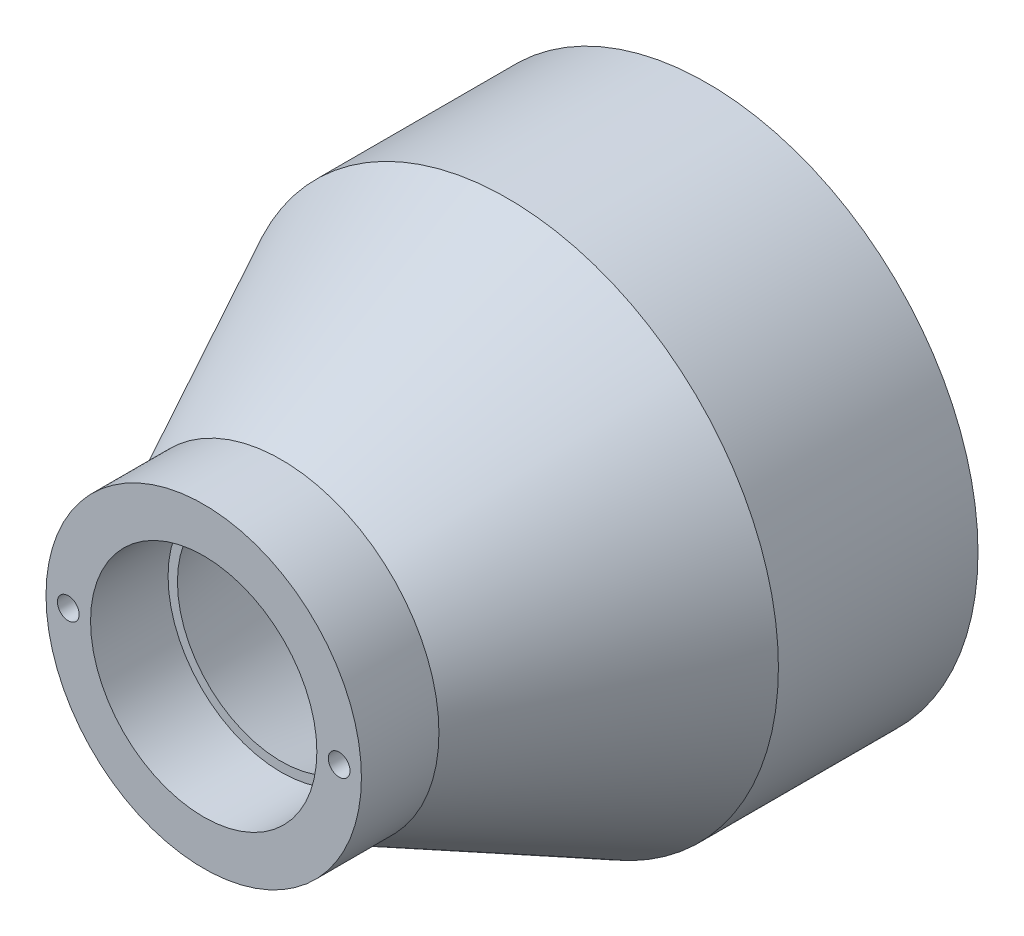
ISO-10303-21;
HEADER;
FILE_DESCRIPTION(('STEP AP214'),'2;1');
FILE_NAME('part.step','',(''),(''),'','','');
FILE_SCHEMA(('AUTOMOTIVE_DESIGN { 1 0 10303 214 1 1 1 1 }'));
ENDSEC;
DATA;
#1=APPLICATION_CONTEXT('core data for automotive mechanical design processes');
#2=APPLICATION_PROTOCOL_DEFINITION('international standard','automotive_design',2000,#1);
#3=PRODUCT_CONTEXT('',#1,'mechanical');
#4=PRODUCT('Part','Part','',(#3));
#5=PRODUCT_RELATED_PRODUCT_CATEGORY('part','',(#4));
#6=PRODUCT_DEFINITION_FORMATION('','',#4);
#7=PRODUCT_DEFINITION_CONTEXT('part definition',#1,'design');
#8=PRODUCT_DEFINITION('design','',#6,#7);
#9=PRODUCT_DEFINITION_SHAPE('','',#8);
#10=(LENGTH_UNIT() NAMED_UNIT(*) SI_UNIT(.MILLI.,.METRE.));
#11=(NAMED_UNIT(*) PLANE_ANGLE_UNIT() SI_UNIT($,.RADIAN.));
#12=(NAMED_UNIT(*) SI_UNIT($,.STERADIAN.) SOLID_ANGLE_UNIT());
#13=UNCERTAINTY_MEASURE_WITH_UNIT(LENGTH_MEASURE(1.E-05),#10,'distance_accuracy_value','');
#14=(GEOMETRIC_REPRESENTATION_CONTEXT(3) GLOBAL_UNCERTAINTY_ASSIGNED_CONTEXT((#13)) GLOBAL_UNIT_ASSIGNED_CONTEXT((#10,
#11,#12)) REPRESENTATION_CONTEXT('',''));
#15=CARTESIAN_POINT('',(0.,0.,0.));
#16=DIRECTION('',(0.,0.,1.));
#17=DIRECTION('',(1.,0.,0.));
#18=AXIS2_PLACEMENT_3D('',#15,#16,#17);
#19=CARTESIAN_POINT('',(0.,0.,8.7));
#20=DIRECTION('',(0.,0.,1.));
#21=DIRECTION('',(1.,0.,0.));
#22=AXIS2_PLACEMENT_3D('',#19,#20,#21);
#23=PLANE('',#22);
#24=CARTESIAN_POINT('',(-15.2,0.,8.7));
#25=DIRECTION('',(0.,0.,1.));
#26=DIRECTION('',(1.,0.,0.));
#27=AXIS2_PLACEMENT_3D('',#24,#25,#26);
#28=CIRCLE('',#27,1.2192);
#29=CARTESIAN_POINT('',(-13.9808,0.,8.7));
#30=VERTEX_POINT('',#29);
#31=EDGE_CURVE('E63',#30,#30,#28,.T.);
#32=ORIENTED_EDGE('',*,*,#31,.F.);
#33=EDGE_LOOP('',(#32));
#34=FACE_BOUND('',#33,.T.);
#35=CARTESIAN_POINT('',(15.2,0.,8.7));
#36=DIRECTION('',(0.,0.,1.));
#37=DIRECTION('',(1.,0.,0.));
#38=AXIS2_PLACEMENT_3D('',#35,#36,#37);
#39=CIRCLE('',#38,1.2192);
#40=CARTESIAN_POINT('',(16.4192,0.,8.7));
#41=VERTEX_POINT('',#40);
#42=EDGE_CURVE('E62',#41,#41,#39,.T.);
#43=ORIENTED_EDGE('',*,*,#42,.F.);
#44=EDGE_LOOP('',(#43));
#45=FACE_BOUND('',#44,.T.);
#46=CARTESIAN_POINT('',(0.,0.,8.7));
#47=DIRECTION('',(0.,0.,1.));
#48=DIRECTION('',(1.,0.,0.));
#49=AXIS2_PLACEMENT_3D('',#46,#47,#48);
#50=CIRCLE('',#49,17.7);
#51=CARTESIAN_POINT('',(17.7,0.,8.7));
#52=VERTEX_POINT('',#51);
#53=EDGE_CURVE('E80',#52,#52,#50,.T.);
#54=ORIENTED_EDGE('',*,*,#53,.T.);
#55=EDGE_LOOP('',(#54));
#56=FACE_BOUND('',#55,.T.);
#57=CARTESIAN_POINT('',(0.,0.,8.7));
#58=DIRECTION('',(0.,0.,1.));
#59=DIRECTION('',(1.,0.,0.));
#60=AXIS2_PLACEMENT_3D('',#57,#58,#59);
#61=CIRCLE('',#60,12.7);
#62=CARTESIAN_POINT('',(12.7,0.,8.7));
#63=VERTEX_POINT('',#62);
#64=EDGE_CURVE('E77',#63,#63,#61,.T.);
#65=ORIENTED_EDGE('',*,*,#64,.F.);
#66=EDGE_LOOP('',(#65));
#67=FACE_BOUND('',#66,.T.);
#68=ADVANCED_FACE('F37',(#34,#45,#56,#67),#23,.T.);
#69=CARTESIAN_POINT('',(0.,0.,8.7));
#70=DIRECTION('',(0.,0.,-1.));
#71=DIRECTION('',(-1.,0.,0.));
#72=AXIS2_PLACEMENT_3D('',#69,#70,#71);
#73=CYLINDRICAL_SURFACE('',#72,17.7);
#74=ORIENTED_EDGE('',*,*,#53,.F.);
#75=EDGE_LOOP('',(#74));
#76=FACE_BOUND('',#75,.T.);
#77=CARTESIAN_POINT('',(0.,0.,0.));
#78=DIRECTION('',(0.,0.,1.));
#79=DIRECTION('',(1.,0.,0.));
#80=AXIS2_PLACEMENT_3D('',#77,#78,#79);
#81=CIRCLE('',#80,17.7);
#82=CARTESIAN_POINT('',(17.7,0.,0.));
#83=VERTEX_POINT('',#82);
#84=EDGE_CURVE('E76',#83,#83,#81,.T.);
#85=ORIENTED_EDGE('',*,*,#84,.T.);
#86=EDGE_LOOP('',(#85));
#87=FACE_BOUND('',#86,.T.);
#88=ADVANCED_FACE('F112',(#76,#87),#73,.T.);
#89=CARTESIAN_POINT('',(0.,0.,8.7));
#90=DIRECTION('',(0.,0.,-1.));
#91=DIRECTION('',(-1.,0.,0.));
#92=AXIS2_PLACEMENT_3D('',#89,#90,#91);
#93=CYLINDRICAL_SURFACE('',#92,12.7);
#94=ORIENTED_EDGE('',*,*,#64,.T.);
#95=EDGE_LOOP('',(#94));
#96=FACE_BOUND('',#95,.T.);
#97=CARTESIAN_POINT('',(0.,0.,0.));
#98=DIRECTION('',(0.,0.,1.));
#99=DIRECTION('',(1.,0.,0.));
#100=AXIS2_PLACEMENT_3D('',#97,#98,#99);
#101=CIRCLE('',#100,12.7);
#102=CARTESIAN_POINT('',(12.7,0.,0.));
#103=VERTEX_POINT('',#102);
#104=EDGE_CURVE('E81',#103,#103,#101,.T.);
#105=ORIENTED_EDGE('',*,*,#104,.F.);
#106=EDGE_LOOP('',(#105));
#107=FACE_BOUND('',#106,.T.);
#108=ADVANCED_FACE('F118',(#96,#107),#93,.F.);
#109=CARTESIAN_POINT('',(0.,0.,0.));
#110=DIRECTION('',(0.,0.,-1.));
#111=DIRECTION('',(-1.,0.,0.));
#112=AXIS2_PLACEMENT_3D('',#109,#110,#111);
#113=PLANE('',#112);
#114=CARTESIAN_POINT('',(0.,0.,0.));
#115=DIRECTION('',(0.,0.,-1.));
#116=DIRECTION('',(-1.,0.,0.));
#117=AXIS2_PLACEMENT_3D('',#114,#115,#116);
#118=CIRCLE('',#117,11.6498025714429);
#119=CARTESIAN_POINT('',(-11.6498025714429,0.,0.));
#120=VERTEX_POINT('',#119);
#121=EDGE_CURVE('E46',#120,#120,#118,.T.);
#122=ORIENTED_EDGE('',*,*,#121,.T.);
#123=EDGE_LOOP('',(#122));
#124=FACE_BOUND('',#123,.T.);
#125=ORIENTED_EDGE('',*,*,#104,.T.);
#126=EDGE_LOOP('',(#125));
#127=FACE_BOUND('',#126,.T.);
#128=ADVANCED_FACE('F96',(#124,#127),#113,.F.);
#129=CARTESIAN_POINT('',(0.,0.,-47.8));
#130=DIRECTION('',(0.,0.,-1.));
#131=DIRECTION('',(-1.,0.,0.));
#132=AXIS2_PLACEMENT_3D('',#129,#130,#131);
#133=PLANE('',#132);
#134=CARTESIAN_POINT('',(0.,0.,-47.8));
#135=DIRECTION('',(0.,0.,-1.));
#136=DIRECTION('',(-1.,0.,0.));
#137=AXIS2_PLACEMENT_3D('',#134,#135,#136);
#138=CIRCLE('',#137,22.4000840289286);
#139=CARTESIAN_POINT('',(-22.4000840289286,0.,-47.8));
#140=VERTEX_POINT('',#139);
#141=EDGE_CURVE('E11',#140,#140,#138,.F.);
#142=ORIENTED_EDGE('',*,*,#141,.T.);
#143=EDGE_LOOP('',(#142));
#144=FACE_BOUND('',#143,.T.);
#145=CARTESIAN_POINT('',(0.,0.,-47.8));
#146=DIRECTION('',(0.,0.,-1.));
#147=DIRECTION('',(-1.,0.,0.));
#148=AXIS2_PLACEMENT_3D('',#145,#146,#147);
#149=CIRCLE('',#148,30.4);
#150=CARTESIAN_POINT('',(30.4,0.,-47.8));
#151=VERTEX_POINT('',#150);
#152=EDGE_CURVE('E73',#151,#151,#149,.T.);
#153=ORIENTED_EDGE('',*,*,#152,.T.);
#154=EDGE_LOOP('',(#153));
#155=FACE_BOUND('',#154,.T.);
#156=ADVANCED_FACE('F138',(#144,#155),#133,.T.);
#157=CARTESIAN_POINT('',(0.,0.,0.));
#158=DIRECTION('',(0.,0.,-1.));
#159=DIRECTION('',(-1.,0.,0.));
#160=AXIS2_PLACEMENT_3D('',#157,#158,#159);
#161=CIRCLE('',#160,17.7000283593577);
#162=CARTESIAN_POINT('',(-17.7000283593577,0.,0.));
#163=VERTEX_POINT('',#162);
#164=EDGE_CURVE('E91',#163,#163,#161,.F.);
#165=ORIENTED_EDGE('',*,*,#164,.T.);
#166=EDGE_LOOP('',(#165));
#167=FACE_BOUND('',#166,.T.);
#168=ORIENTED_EDGE('',*,*,#84,.F.);
#169=EDGE_LOOP('',(#168));
#170=FACE_BOUND('',#169,.T.);
#171=ADVANCED_FACE('F134',(#167,#170),#113,.F.);
#172=CARTESIAN_POINT('',(0.,0.,-47.8));
#173=DIRECTION('',(0.,0.,1.));
#174=DIRECTION('',(1.,0.,0.));
#175=AXIS2_PLACEMENT_3D('',#172,#173,#174);
#176=CYLINDRICAL_SURFACE('',#175,30.4);
#177=CARTESIAN_POINT('',(0.,0.,-25.4));
#178=DIRECTION('',(0.,0.,-1.));
#179=DIRECTION('',(-1.,0.,0.));
#180=AXIS2_PLACEMENT_3D('',#177,#178,#179);
#181=CIRCLE('',#180,30.4);
#182=CARTESIAN_POINT('',(30.4,0.,-25.4));
#183=VERTEX_POINT('',#182);
#184=EDGE_CURVE('E86',#183,#183,#181,.T.);
#185=CARTESIAN_POINT('',(30.4,0.,-25.4));
#186=CARTESIAN_POINT('',(30.4,0.,-25.6333333333333));
#187=CARTESIAN_POINT('',(30.4,0.,-25.8666666666667));
#188=CARTESIAN_POINT('',(30.4,0.,-26.3333333333333));
#189=CARTESIAN_POINT('',(30.4,0.,-26.5666666666667));
#190=CARTESIAN_POINT('',(30.4,0.,-27.0333333333333));
#191=CARTESIAN_POINT('',(30.4,0.,-27.2666666666667));
#192=CARTESIAN_POINT('',(30.4,0.,-27.7333333333333));
#193=CARTESIAN_POINT('',(30.4,0.,-27.9666666666667));
#194=CARTESIAN_POINT('',(30.4,0.,-28.4333333333333));
#195=CARTESIAN_POINT('',(30.4,0.,-28.6666666666667));
#196=CARTESIAN_POINT('',(30.4,0.,-29.1333333333333));
#197=CARTESIAN_POINT('',(30.4,0.,-29.3666666666667));
#198=CARTESIAN_POINT('',(30.4,0.,-29.8333333333333));
#199=CARTESIAN_POINT('',(30.4,0.,-30.0666666666667));
#200=CARTESIAN_POINT('',(30.4,0.,-30.5333333333333));
#201=CARTESIAN_POINT('',(30.4,0.,-30.7666666666667));
#202=CARTESIAN_POINT('',(30.4,0.,-31.2333333333333));
#203=CARTESIAN_POINT('',(30.4,0.,-31.4666666666667));
#204=CARTESIAN_POINT('',(30.4,0.,-31.9333333333333));
#205=CARTESIAN_POINT('',(30.4,0.,-32.1666666666667));
#206=CARTESIAN_POINT('',(30.4,0.,-32.6333333333333));
#207=CARTESIAN_POINT('',(30.4,0.,-32.8666666666667));
#208=CARTESIAN_POINT('',(30.4,0.,-33.3333333333333));
#209=CARTESIAN_POINT('',(30.4,0.,-33.5666666666667));
#210=CARTESIAN_POINT('',(30.4,0.,-34.0333333333333));
#211=CARTESIAN_POINT('',(30.4,0.,-34.2666666666667));
#212=CARTESIAN_POINT('',(30.4,0.,-34.7333333333333));
#213=CARTESIAN_POINT('',(30.4,0.,-34.9666666666667));
#214=CARTESIAN_POINT('',(30.4,0.,-35.4333333333333));
#215=CARTESIAN_POINT('',(30.4,0.,-35.6666666666667));
#216=CARTESIAN_POINT('',(30.4,0.,-36.1333333333333));
#217=CARTESIAN_POINT('',(30.4,0.,-36.3666666666667));
#218=CARTESIAN_POINT('',(30.4,0.,-36.8333333333333));
#219=CARTESIAN_POINT('',(30.4,0.,-37.0666666666667));
#220=CARTESIAN_POINT('',(30.4,0.,-37.5333333333333));
#221=CARTESIAN_POINT('',(30.4,0.,-37.7666666666667));
#222=CARTESIAN_POINT('',(30.4,0.,-38.2333333333333));
#223=CARTESIAN_POINT('',(30.4,0.,-38.4666666666667));
#224=CARTESIAN_POINT('',(30.4,0.,-38.9333333333333));
#225=CARTESIAN_POINT('',(30.4,0.,-39.1666666666667));
#226=CARTESIAN_POINT('',(30.4,0.,-39.6333333333333));
#227=CARTESIAN_POINT('',(30.4,0.,-39.8666666666667));
#228=CARTESIAN_POINT('',(30.4,0.,-40.3333333333333));
#229=CARTESIAN_POINT('',(30.4,0.,-40.5666666666667));
#230=CARTESIAN_POINT('',(30.4,0.,-41.0333333333333));
#231=CARTESIAN_POINT('',(30.4,0.,-41.2666666666667));
#232=CARTESIAN_POINT('',(30.4,0.,-41.7333333333333));
#233=CARTESIAN_POINT('',(30.4,0.,-41.9666666666667));
#234=CARTESIAN_POINT('',(30.4,0.,-42.4333333333333));
#235=CARTESIAN_POINT('',(30.4,0.,-42.6666666666667));
#236=CARTESIAN_POINT('',(30.4,0.,-43.1333333333333));
#237=CARTESIAN_POINT('',(30.4,0.,-43.3666666666667));
#238=CARTESIAN_POINT('',(30.4,0.,-43.8333333333333));
#239=CARTESIAN_POINT('',(30.4,0.,-44.0666666666667));
#240=CARTESIAN_POINT('',(30.4,0.,-44.5333333333333));
#241=CARTESIAN_POINT('',(30.4,0.,-44.7666666666667));
#242=CARTESIAN_POINT('',(30.4,0.,-45.2333333333333));
#243=CARTESIAN_POINT('',(30.4,0.,-45.4666666666667));
#244=CARTESIAN_POINT('',(30.4,0.,-45.9333333333333));
#245=CARTESIAN_POINT('',(30.4,0.,-46.1666666666667));
#246=CARTESIAN_POINT('',(30.4,0.,-46.6333333333333));
#247=CARTESIAN_POINT('',(30.4,0.,-46.8666666666667));
#248=CARTESIAN_POINT('',(30.4,0.,-47.3333333333333));
#249=CARTESIAN_POINT('',(30.4,0.,-47.5666666666667));
#250=CARTESIAN_POINT('',(30.4,0.,-47.8));
#251=B_SPLINE_CURVE_WITH_KNOTS('',3,(#185,#186,#187,#188,#189,#190,#191,#192,#193,#194,#195,
#196,#197,#198,#199,#200,#201,#202,#203,#204,#205,#206,#207,#208,#209,#210,#211,#212,#213,#214,
#215,#216,#217,#218,#219,#220,#221,#222,#223,#224,#225,#226,#227,#228,#229,#230,#231,#232,#233,
#234,#235,#236,#237,#238,#239,#240,#241,#242,#243,#244,#245,#246,#247,#248,#249,#250),
.UNSPECIFIED.,.F.,.F.,(4,2,2,2,2,2,2,2,2,2,2,2,2,2,2,2,2,2,2,2,2,2,2,2,2,2,2,2,2,2,2,2,4),(0.,
0.699999999999999,1.4,2.1,2.8,3.5,4.2,4.9,5.6,6.3,7.,7.69999999999999,8.4,9.1,9.8,10.5,11.2,
11.9,12.6,13.3,14.,14.7,15.4,16.1,16.8,17.5,18.2,18.9,19.6,20.3,21.,21.7,22.4),.UNSPECIFIED.);
#252=EDGE_CURVE('BSEAM108',#183,#151,#251,.T.);
#253=ORIENTED_EDGE('',*,*,#184,.T.);
#254=ORIENTED_EDGE('',*,*,#152,.F.);
#255=ORIENTED_EDGE('',*,*,#252,.T.);
#256=ORIENTED_EDGE('',*,*,#252,.F.);
#257=EDGE_LOOP('',(#253,#255,#254,#256));
#258=FACE_BOUND('',#257,.T.);
#259=ADVANCED_FACE('F108',(#258),#176,.T.);
#260=CARTESIAN_POINT('',(0.,0.,-25.4));
#261=DIRECTION('',(0.,0.,-1.));
#262=DIRECTION('',(-1.,0.,0.));
#263=AXIS2_PLACEMENT_3D('',#260,#261,#262);
#264=CONICAL_SURFACE('',#263,30.4,0.463646715792292);
#265=ORIENTED_EDGE('',*,*,#164,.F.);
#266=EDGE_LOOP('',(#265));
#267=FACE_BOUND('',#266,.T.);
#268=ORIENTED_EDGE('',*,*,#184,.F.);
#269=EDGE_LOOP('',(#268));
#270=FACE_BOUND('',#269,.T.);
#271=ADVANCED_FACE('F101',(#267,#270),#264,.T.);
#272=CARTESIAN_POINT('',(0.,0.,2.00000000000007));
#273=DIRECTION('',(0.,0.,-1.));
#274=DIRECTION('',(-1.,0.,0.));
#275=AXIS2_PLACEMENT_3D('',#272,#273,#274);
#276=CONICAL_SURFACE('',#275,11.2,0.221220482690289);
#277=ORIENTED_EDGE('',*,*,#141,.F.);
#278=EDGE_LOOP('',(#277));
#279=FACE_BOUND('',#278,.T.);
#280=ORIENTED_EDGE('',*,*,#121,.F.);
#281=EDGE_LOOP('',(#280));
#282=FACE_BOUND('',#281,.T.);
#283=ADVANCED_FACE('F40',(#279,#282),#276,.F.);
#284=CARTESIAN_POINT('',(15.2,0.,3.7));
#285=DIRECTION('',(0.,0.,1.));
#286=DIRECTION('',(1.,0.,0.));
#287=AXIS2_PLACEMENT_3D('',#284,#285,#286);
#288=CONICAL_SURFACE('',#287,1.2192,1.02974425867665);
#289=CARTESIAN_POINT('',(15.2,0.,2.9674307332816));
#290=VERTEX_POINT('',#289);
#291=VERTEX_LOOP('',#290);
#292=FACE_BOUND('',#291,.T.);
#293=CARTESIAN_POINT('',(15.2,0.,3.7));
#294=DIRECTION('',(0.,0.,1.));
#295=DIRECTION('',(1.,0.,0.));
#296=AXIS2_PLACEMENT_3D('',#293,#294,#295);
#297=CIRCLE('',#296,1.2192);
#298=CARTESIAN_POINT('',(16.4192,0.,3.7));
#299=VERTEX_POINT('',#298);
#300=EDGE_CURVE('E66',#299,#299,#297,.T.);
#301=ORIENTED_EDGE('',*,*,#300,.T.);
#302=EDGE_LOOP('',(#301));
#303=FACE_BOUND('',#302,.T.);
#304=ADVANCED_FACE('F100',(#292,#303),#288,.F.);
#305=CARTESIAN_POINT('',(15.2,0.,8.7));
#306=DIRECTION('',(0.,0.,1.));
#307=DIRECTION('',(1.,0.,0.));
#308=AXIS2_PLACEMENT_3D('',#305,#306,#307);
#309=CYLINDRICAL_SURFACE('',#308,1.2192);
#310=ORIENTED_EDGE('',*,*,#300,.F.);
#311=EDGE_LOOP('',(#310));
#312=FACE_BOUND('',#311,.T.);
#313=ORIENTED_EDGE('',*,*,#42,.T.);
#314=EDGE_LOOP('',(#313));
#315=FACE_BOUND('',#314,.T.);
#316=ADVANCED_FACE('F56',(#312,#315),#309,.F.);
#317=CARTESIAN_POINT('',(-15.2,0.,3.7));
#318=DIRECTION('',(0.,0.,1.));
#319=DIRECTION('',(1.,0.,0.));
#320=AXIS2_PLACEMENT_3D('',#317,#318,#319);
#321=CONICAL_SURFACE('',#320,1.2192,1.02974425867665);
#322=CARTESIAN_POINT('',(-15.2,0.,2.9674307332816));
#323=VERTEX_POINT('',#322);
#324=VERTEX_LOOP('',#323);
#325=FACE_BOUND('',#324,.T.);
#326=CARTESIAN_POINT('',(-15.2,0.,3.7));
#327=DIRECTION('',(0.,0.,1.));
#328=DIRECTION('',(1.,0.,0.));
#329=AXIS2_PLACEMENT_3D('',#326,#327,#328);
#330=CIRCLE('',#329,1.2192);
#331=CARTESIAN_POINT('',(-13.9808,0.,3.7));
#332=VERTEX_POINT('',#331);
#333=EDGE_CURVE('E60',#332,#332,#330,.T.);
#334=ORIENTED_EDGE('',*,*,#333,.T.);
#335=EDGE_LOOP('',(#334));
#336=FACE_BOUND('',#335,.T.);
#337=ADVANCED_FACE('F52',(#325,#336),#321,.F.);
#338=CARTESIAN_POINT('',(-15.2,0.,8.7));
#339=DIRECTION('',(0.,0.,1.));
#340=DIRECTION('',(1.,0.,0.));
#341=AXIS2_PLACEMENT_3D('',#338,#339,#340);
#342=CYLINDRICAL_SURFACE('',#341,1.2192);
#343=ORIENTED_EDGE('',*,*,#333,.F.);
#344=EDGE_LOOP('',(#343));
#345=FACE_BOUND('',#344,.T.);
#346=ORIENTED_EDGE('',*,*,#31,.T.);
#347=EDGE_LOOP('',(#346));
#348=FACE_BOUND('',#347,.T.);
#349=ADVANCED_FACE('F55',(#345,#348),#342,.F.);
#350=CLOSED_SHELL('',(#68,#88,#108,#128,#156,#171,#259,#271,#283,#304,#316,#337,#349));
#351=MANIFOLD_SOLID_BREP('B2',#350);
#352=ADVANCED_BREP_SHAPE_REPRESENTATION('',(#18,#351),#14);
#353=SHAPE_DEFINITION_REPRESENTATION(#9,#352);
ENDSEC;
END-ISO-10303-21;
